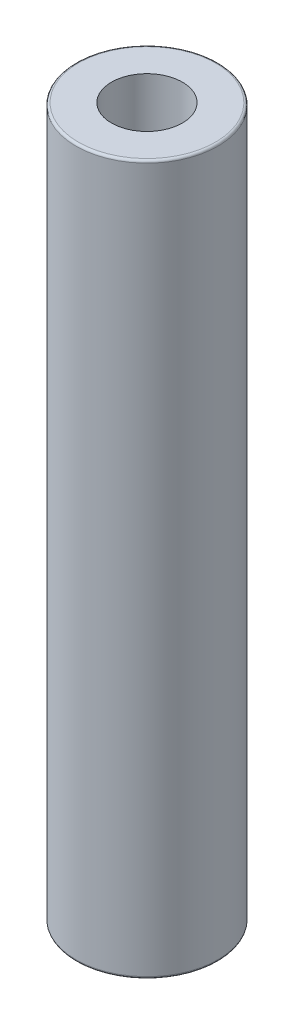
ISO-10303-21;
HEADER;
FILE_DESCRIPTION(('STEP AP214'),'2;1');
FILE_NAME('part.step','',(''),(''),'','','');
FILE_SCHEMA(('AUTOMOTIVE_DESIGN { 1 0 10303 214 1 1 1 1 }'));
ENDSEC;
DATA;
#1=APPLICATION_CONTEXT('core data for automotive mechanical design processes');
#2=APPLICATION_PROTOCOL_DEFINITION('international standard','automotive_design',2000,#1);
#3=PRODUCT_CONTEXT('',#1,'mechanical');
#4=PRODUCT('Part','Part','',(#3));
#5=PRODUCT_RELATED_PRODUCT_CATEGORY('part','',(#4));
#6=PRODUCT_DEFINITION_FORMATION('','',#4);
#7=PRODUCT_DEFINITION_CONTEXT('part definition',#1,'design');
#8=PRODUCT_DEFINITION('design','',#6,#7);
#9=PRODUCT_DEFINITION_SHAPE('','',#8);
#10=(LENGTH_UNIT() NAMED_UNIT(*) SI_UNIT(.MILLI.,.METRE.));
#11=(NAMED_UNIT(*) PLANE_ANGLE_UNIT() SI_UNIT($,.RADIAN.));
#12=(NAMED_UNIT(*) SI_UNIT($,.STERADIAN.) SOLID_ANGLE_UNIT());
#13=UNCERTAINTY_MEASURE_WITH_UNIT(LENGTH_MEASURE(1.E-05),#10,'distance_accuracy_value','');
#14=(GEOMETRIC_REPRESENTATION_CONTEXT(3) GLOBAL_UNCERTAINTY_ASSIGNED_CONTEXT((#13)) GLOBAL_UNIT_ASSIGNED_CONTEXT((#10,
#11,#12)) REPRESENTATION_CONTEXT('',''));
#15=CARTESIAN_POINT('',(0.,0.,0.));
#16=DIRECTION('',(0.,0.,1.));
#17=DIRECTION('',(1.,0.,0.));
#18=AXIS2_PLACEMENT_3D('',#15,#16,#17);
#19=CARTESIAN_POINT('',(0.,30.,0.));
#20=DIRECTION('',(0.,1.,0.));
#21=DIRECTION('',(0.,0.,1.));
#22=AXIS2_PLACEMENT_3D('',#19,#20,#21);
#23=PLANE('',#22);
#24=CARTESIAN_POINT('',(0.,30.,0.));
#25=DIRECTION('',(0.,1.,0.));
#26=DIRECTION('',(0.,0.,1.));
#27=AXIS2_PLACEMENT_3D('',#24,#25,#26);
#28=CIRCLE('',#27,2.9);
#29=CARTESIAN_POINT('',(0.,30.,2.9));
#30=VERTEX_POINT('',#29);
#31=EDGE_CURVE('E10',#30,#30,#28,.T.);
#32=ORIENTED_EDGE('',*,*,#31,.T.);
#33=EDGE_LOOP('',(#32));
#34=FACE_BOUND('',#33,.T.);
#35=CARTESIAN_POINT('',(0.,30.,0.));
#36=DIRECTION('',(0.,1.,0.));
#37=DIRECTION('',(0.,0.,1.));
#38=AXIS2_PLACEMENT_3D('',#35,#36,#37);
#39=CIRCLE('',#38,1.5);
#40=CARTESIAN_POINT('',(0.,30.,1.5));
#41=VERTEX_POINT('',#40);
#42=EDGE_CURVE('E61',#41,#41,#39,.T.);
#43=ORIENTED_EDGE('',*,*,#42,.F.);
#44=EDGE_LOOP('',(#43));
#45=FACE_BOUND('',#44,.T.);
#46=ADVANCED_FACE('F37',(#34,#45),#23,.T.);
#47=CARTESIAN_POINT('',(0.,0.,0.));
#48=DIRECTION('',(0.,1.,0.));
#49=DIRECTION('',(0.,0.,1.));
#50=AXIS2_PLACEMENT_3D('',#47,#48,#49);
#51=PLANE('',#50);
#52=CARTESIAN_POINT('',(0.,0.,0.));
#53=DIRECTION('',(0.,1.,0.));
#54=DIRECTION('',(0.,0.,1.));
#55=AXIS2_PLACEMENT_3D('',#52,#53,#54);
#56=CIRCLE('',#55,2.9);
#57=CARTESIAN_POINT('',(0.,0.,2.9));
#58=VERTEX_POINT('',#57);
#59=EDGE_CURVE('E45',#58,#58,#56,.F.);
#60=ORIENTED_EDGE('',*,*,#59,.T.);
#61=EDGE_LOOP('',(#60));
#62=FACE_BOUND('',#61,.T.);
#63=CARTESIAN_POINT('',(0.,0.,0.));
#64=DIRECTION('',(0.,1.,0.));
#65=DIRECTION('',(0.,0.,1.));
#66=AXIS2_PLACEMENT_3D('',#63,#64,#65);
#67=CIRCLE('',#66,1.5);
#68=CARTESIAN_POINT('',(0.,0.,1.5));
#69=VERTEX_POINT('',#68);
#70=EDGE_CURVE('E62',#69,#69,#67,.T.);
#71=ORIENTED_EDGE('',*,*,#70,.T.);
#72=EDGE_LOOP('',(#71));
#73=FACE_BOUND('',#72,.T.);
#74=ADVANCED_FACE('F74',(#62,#73),#51,.F.);
#75=CARTESIAN_POINT('',(0.,30.,0.));
#76=DIRECTION('',(0.,-1.,0.));
#77=DIRECTION('',(0.,0.,-1.));
#78=AXIS2_PLACEMENT_3D('',#75,#76,#77);
#79=CYLINDRICAL_SURFACE('',#78,3.);
#80=CARTESIAN_POINT('',(0.,0.0999999999999994,0.));
#81=DIRECTION('',(0.,1.,0.));
#82=DIRECTION('',(0.,0.,1.));
#83=AXIS2_PLACEMENT_3D('',#80,#81,#82);
#84=CIRCLE('',#83,3.);
#85=CARTESIAN_POINT('',(0.,0.0999999999999994,3.));
#86=VERTEX_POINT('',#85);
#87=EDGE_CURVE('E50',#86,#86,#84,.T.);
#88=ORIENTED_EDGE('',*,*,#87,.T.);
#89=EDGE_LOOP('',(#88));
#90=FACE_BOUND('',#89,.T.);
#91=CARTESIAN_POINT('',(0.,29.9,0.));
#92=DIRECTION('',(0.,1.,0.));
#93=DIRECTION('',(0.,0.,1.));
#94=AXIS2_PLACEMENT_3D('',#91,#92,#93);
#95=CIRCLE('',#94,3.);
#96=CARTESIAN_POINT('',(0.,29.9,3.));
#97=VERTEX_POINT('',#96);
#98=EDGE_CURVE('E55',#97,#97,#95,.F.);
#99=ORIENTED_EDGE('',*,*,#98,.T.);
#100=EDGE_LOOP('',(#99));
#101=FACE_BOUND('',#100,.T.);
#102=ADVANCED_FACE('F79',(#90,#101),#79,.T.);
#103=CARTESIAN_POINT('',(0.,30.,0.));
#104=DIRECTION('',(0.,-1.,0.));
#105=DIRECTION('',(0.,0.,-1.));
#106=AXIS2_PLACEMENT_3D('',#103,#104,#105);
#107=CYLINDRICAL_SURFACE('',#106,1.5);
#108=ORIENTED_EDGE('',*,*,#42,.T.);
#109=EDGE_LOOP('',(#108));
#110=FACE_BOUND('',#109,.T.);
#111=ORIENTED_EDGE('',*,*,#70,.F.);
#112=EDGE_LOOP('',(#111));
#113=FACE_BOUND('',#112,.T.);
#114=ADVANCED_FACE('F70',(#110,#113),#107,.F.);
#115=CARTESIAN_POINT('',(0.,0.0999999999999994,0.));
#116=DIRECTION('',(0.,1.,0.));
#117=DIRECTION('',(0.,0.,1.));
#118=AXIS2_PLACEMENT_3D('',#115,#116,#117);
#119=TOROIDAL_SURFACE('',#118,2.9,0.1);
#120=ORIENTED_EDGE('',*,*,#59,.F.);
#121=EDGE_LOOP('',(#120));
#122=FACE_BOUND('',#121,.T.);
#123=ORIENTED_EDGE('',*,*,#87,.F.);
#124=EDGE_LOOP('',(#123));
#125=FACE_BOUND('',#124,.T.);
#126=ADVANCED_FACE('F85',(#122,#125),#119,.T.);
#127=CARTESIAN_POINT('',(0.,29.9,0.));
#128=DIRECTION('',(0.,1.,0.));
#129=DIRECTION('',(0.,0.,1.));
#130=AXIS2_PLACEMENT_3D('',#127,#128,#129);
#131=TOROIDAL_SURFACE('',#130,2.9,0.1);
#132=ORIENTED_EDGE('',*,*,#98,.F.);
#133=EDGE_LOOP('',(#132));
#134=FACE_BOUND('',#133,.T.);
#135=ORIENTED_EDGE('',*,*,#31,.F.);
#136=EDGE_LOOP('',(#135));
#137=FACE_BOUND('',#136,.T.);
#138=ADVANCED_FACE('F39',(#134,#137),#131,.T.);
#139=CLOSED_SHELL('',(#46,#74,#102,#114,#126,#138));
#140=MANIFOLD_SOLID_BREP('B2',#139);
#141=ADVANCED_BREP_SHAPE_REPRESENTATION('',(#18,#140),#14);
#142=SHAPE_DEFINITION_REPRESENTATION(#9,#141);
ENDSEC;
END-ISO-10303-21;
